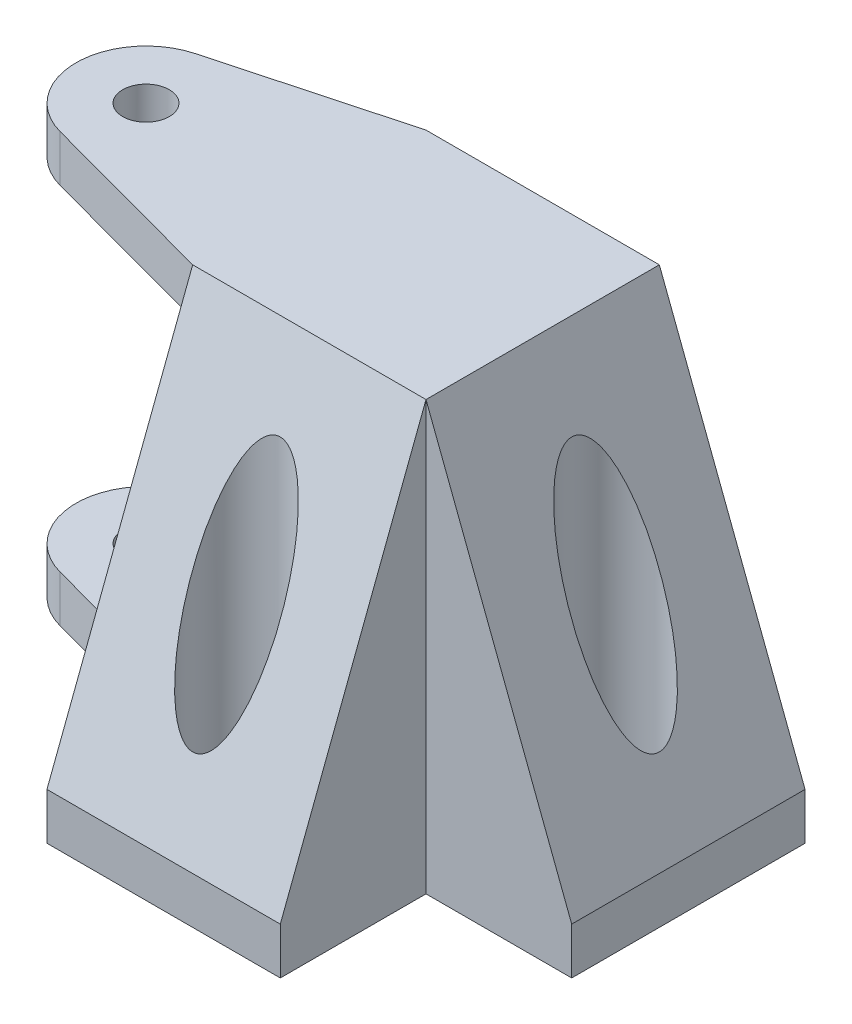
ISO-10303-21;
HEADER;
FILE_DESCRIPTION(('STEP AP214'),'2;1');
FILE_NAME('part.step','',(''),(''),'','','');
FILE_SCHEMA(('AUTOMOTIVE_DESIGN { 1 0 10303 214 1 1 1 1 }'));
ENDSEC;
DATA;
#1=APPLICATION_CONTEXT('core data for automotive mechanical design processes');
#2=APPLICATION_PROTOCOL_DEFINITION('international standard','automotive_design',2000,#1);
#3=PRODUCT_CONTEXT('',#1,'mechanical');
#4=PRODUCT('Part','Part','',(#3));
#5=PRODUCT_RELATED_PRODUCT_CATEGORY('part','',(#4));
#6=PRODUCT_DEFINITION_FORMATION('','',#4);
#7=PRODUCT_DEFINITION_CONTEXT('part definition',#1,'design');
#8=PRODUCT_DEFINITION('design','',#6,#7);
#9=PRODUCT_DEFINITION_SHAPE('','',#8);
#10=(LENGTH_UNIT() NAMED_UNIT(*) SI_UNIT(.MILLI.,.METRE.));
#11=(NAMED_UNIT(*) PLANE_ANGLE_UNIT() SI_UNIT($,.RADIAN.));
#12=(NAMED_UNIT(*) SI_UNIT($,.STERADIAN.) SOLID_ANGLE_UNIT());
#13=UNCERTAINTY_MEASURE_WITH_UNIT(LENGTH_MEASURE(1.E-05),#10,'distance_accuracy_value','');
#14=(GEOMETRIC_REPRESENTATION_CONTEXT(3) GLOBAL_UNCERTAINTY_ASSIGNED_CONTEXT((#13)) GLOBAL_UNIT_ASSIGNED_CONTEXT((#10,
#11,#12)) REPRESENTATION_CONTEXT('',''));
#15=CARTESIAN_POINT('',(0.,0.,0.));
#16=DIRECTION('',(0.,0.,1.));
#17=DIRECTION('',(1.,0.,0.));
#18=AXIS2_PLACEMENT_3D('',#15,#16,#17);
#19=CARTESIAN_POINT('',(-20.,0.,52.4890829694323));
#20=DIRECTION('',(0.,1.,0.));
#21=DIRECTION('',(0.,0.,1.));
#22=AXIS2_PLACEMENT_3D('',#19,#20,#21);
#23=CYLINDRICAL_SURFACE('',#22,4.);
#24=CARTESIAN_POINT('',(-20.,0.,52.4890829694323));
#25=DIRECTION('',(0.,1.,0.));
#26=DIRECTION('',(0.,0.,1.));
#27=AXIS2_PLACEMENT_3D('',#24,#25,#26);
#28=CIRCLE('',#27,4.);
#29=CARTESIAN_POINT('',(-20.,0.,56.4890829694323));
#30=VERTEX_POINT('',#29);
#31=EDGE_CURVE('E323',#30,#30,#28,.T.);
#32=ORIENTED_EDGE('',*,*,#31,.F.);
#33=EDGE_LOOP('',(#32));
#34=FACE_BOUND('',#33,.T.);
#35=CARTESIAN_POINT('',(-20.,5.,52.4890829694323));
#36=DIRECTION('',(0.,1.,0.));
#37=DIRECTION('',(0.,0.,1.));
#38=AXIS2_PLACEMENT_3D('',#35,#36,#37);
#39=CIRCLE('',#38,4.);
#40=CARTESIAN_POINT('',(-20.,5.,56.4890829694323));
#41=VERTEX_POINT('',#40);
#42=EDGE_CURVE('E302',#41,#41,#39,.F.);
#43=ORIENTED_EDGE('',*,*,#42,.F.);
#44=EDGE_LOOP('',(#43));
#45=FACE_BOUND('',#44,.T.);
#46=ADVANCED_FACE('F42',(#34,#45),#23,.F.);
#47=CARTESIAN_POINT('',(12.4890829694323,0.,20.));
#48=DIRECTION('',(0.,1.,0.));
#49=DIRECTION('',(0.,0.,1.));
#50=AXIS2_PLACEMENT_3D('',#47,#48,#49);
#51=CYLINDRICAL_SURFACE('',#50,4.);
#52=CARTESIAN_POINT('',(12.4890829694323,0.,20.));
#53=DIRECTION('',(0.,1.,0.));
#54=DIRECTION('',(0.,0.,1.));
#55=AXIS2_PLACEMENT_3D('',#52,#53,#54);
#56=CIRCLE('',#55,4.);
#57=CARTESIAN_POINT('',(12.4890829694323,0.,24.));
#58=VERTEX_POINT('',#57);
#59=EDGE_CURVE('E297',#58,#58,#56,.T.);
#60=ORIENTED_EDGE('',*,*,#59,.F.);
#61=EDGE_LOOP('',(#60));
#62=FACE_BOUND('',#61,.T.);
#63=CARTESIAN_POINT('',(12.4890829694323,5.,20.));
#64=DIRECTION('',(0.,1.,0.));
#65=DIRECTION('',(0.,0.,1.));
#66=AXIS2_PLACEMENT_3D('',#63,#64,#65);
#67=CIRCLE('',#66,4.);
#68=CARTESIAN_POINT('',(12.4890829694323,5.,24.));
#69=VERTEX_POINT('',#68);
#70=EDGE_CURVE('E298',#69,#69,#67,.F.);
#71=ORIENTED_EDGE('',*,*,#70,.F.);
#72=EDGE_LOOP('',(#71));
#73=FACE_BOUND('',#72,.T.);
#74=ADVANCED_FACE('F358',(#62,#73),#51,.F.);
#75=CARTESIAN_POINT('',(0.,0.,40.));
#76=DIRECTION('',(0.,0.,-1.));
#77=DIRECTION('',(-1.,0.,0.));
#78=AXIS2_PLACEMENT_3D('',#75,#76,#77);
#79=PLANE('',#78);
#80=DIRECTION('',(0.,1.,0.));
#81=VECTOR('',#80,1.);
#82=CARTESIAN_POINT('',(0.,73.3918284369733,40.));
#83=LINE('',#82,#81);
#84=CARTESIAN_POINT('',(0.,0.,40.));
#85=VERTEX_POINT('',#84);
#86=CARTESIAN_POINT('',(0.,73.3918284369733,40.));
#87=VERTEX_POINT('',#86);
#88=EDGE_CURVE('E60',#85,#87,#83,.T.);
#89=ORIENTED_EDGE('',*,*,#88,.F.);
#90=DIRECTION('',(1.,0.,0.));
#91=VECTOR('',#90,1.);
#92=CARTESIAN_POINT('',(0.,0.,40.));
#93=LINE('',#92,#91);
#94=CARTESIAN_POINT('',(24.9781659388646,0.,40.));
#95=VERTEX_POINT('',#94);
#96=EDGE_CURVE('E246',#85,#95,#93,.T.);
#97=ORIENTED_EDGE('',*,*,#96,.T.);
#98=DIRECTION('',(0.,1.,0.));
#99=VECTOR('',#98,1.);
#100=CARTESIAN_POINT('',(24.9781659388646,8.,40.));
#101=LINE('',#100,#99);
#102=CARTESIAN_POINT('',(24.9781659388646,8.,40.));
#103=VERTEX_POINT('',#102);
#104=EDGE_CURVE('E249',#95,#103,#101,.T.);
#105=ORIENTED_EDGE('',*,*,#104,.T.);
#106=DIRECTION('',(-0.35683094198378,0.934168977671046,0.));
#107=VECTOR('',#106,1.);
#108=CARTESIAN_POINT('',(0.,73.3918284369733,40.));
#109=LINE('',#108,#107);
#110=EDGE_CURVE('E253',#103,#87,#109,.T.);
#111=ORIENTED_EDGE('',*,*,#110,.T.);
#112=EDGE_LOOP('',(#89,#97,#105,#111));
#113=FACE_BOUND('',#112,.T.);
#114=ADVANCED_FACE('F364',(#113),#79,.F.);
#115=CARTESIAN_POINT('',(-40.,0.,40.));
#116=DIRECTION('',(0.260963361371524,0.,-0.965348705920133));
#117=DIRECTION('',(-0.965348705920133,0.,-0.260963361371524));
#118=AXIS2_PLACEMENT_3D('',#115,#116,#117);
#119=PLANE('',#118);
#120=DIRECTION('',(-0.965348705920133,0.,-0.260963361371524));
#121=VECTOR('',#120,1.);
#122=CARTESIAN_POINT('',(-40.,65.3918284369732,40.));
#123=LINE('',#122,#121);
#124=CARTESIAN_POINT('',(-40.,65.3918284369732,40.));
#125=VERTEX_POINT('',#124);
#126=CARTESIAN_POINT('',(-71.1315603364583,65.3918284369732,31.5841844710416));
#127=VERTEX_POINT('',#126);
#128=EDGE_CURVE('E210',#125,#127,#123,.T.);
#129=ORIENTED_EDGE('',*,*,#128,.F.);
#130=DIRECTION('',(0.,-1.,0.));
#131=VECTOR('',#130,1.);
#132=CARTESIAN_POINT('',(-40.,0.,40.));
#133=LINE('',#132,#131);
#134=CARTESIAN_POINT('',(-40.,73.3918284369733,40.));
#135=VERTEX_POINT('',#134);
#136=EDGE_CURVE('E259',#135,#125,#133,.T.);
#137=ORIENTED_EDGE('',*,*,#136,.F.);
#138=DIRECTION('',(-0.965348705920133,0.,-0.260963361371524));
#139=VECTOR('',#138,1.);
#140=CARTESIAN_POINT('',(-40.,73.3918284369733,40.));
#141=LINE('',#140,#139);
#142=CARTESIAN_POINT('',(-71.1315603364583,73.3918284369733,31.5841844710416));
#143=VERTEX_POINT('',#142);
#144=EDGE_CURVE('E213',#135,#143,#141,.T.);
#145=ORIENTED_EDGE('',*,*,#144,.T.);
#146=DIRECTION('',(0.,1.,0.));
#147=VECTOR('',#146,1.);
#148=CARTESIAN_POINT('',(-71.1315603364583,0.,31.5841844710416));
#149=LINE('',#148,#147);
#150=EDGE_CURVE('E240',#127,#143,#149,.T.);
#151=ORIENTED_EDGE('',*,*,#150,.F.);
#152=EDGE_LOOP('',(#129,#137,#145,#151));
#153=FACE_BOUND('',#152,.T.);
#154=ADVANCED_FACE('F403',(#153),#119,.F.);
#155=DIRECTION('',(0.965348705920133,0.,0.260963361371524));
#156=VECTOR('',#155,1.);
#157=CARTESIAN_POINT('',(-40.,8.,40.));
#158=LINE('',#157,#156);
#159=CARTESIAN_POINT('',(-71.1315603364583,8.,31.5841844710416));
#160=VERTEX_POINT('',#159);
#161=CARTESIAN_POINT('',(-40.,8.,40.));
#162=VERTEX_POINT('',#161);
#163=EDGE_CURVE('E204',#160,#162,#158,.T.);
#164=ORIENTED_EDGE('',*,*,#163,.F.);
#165=CARTESIAN_POINT('',(-71.1315603364583,0.,31.5841844710416));
#166=VERTEX_POINT('',#165);
#167=EDGE_CURVE('E241',#166,#160,#149,.T.);
#168=ORIENTED_EDGE('',*,*,#167,.F.);
#169=DIRECTION('',(-0.965348705920133,0.,-0.260963361371524));
#170=VECTOR('',#169,1.);
#171=CARTESIAN_POINT('',(-40.,0.,40.));
#172=LINE('',#171,#170);
#173=CARTESIAN_POINT('',(-40.,0.,40.));
#174=VERTEX_POINT('',#173);
#175=EDGE_CURVE('E214',#174,#166,#172,.T.);
#176=ORIENTED_EDGE('',*,*,#175,.F.);
#177=EDGE_CURVE('E258',#162,#174,#133,.T.);
#178=ORIENTED_EDGE('',*,*,#177,.F.);
#179=EDGE_LOOP('',(#164,#168,#176,#178));
#180=FACE_BOUND('',#179,.T.);
#181=ADVANCED_FACE('F401',(#180),#119,.F.);
#182=CARTESIAN_POINT('',(-68.,0.,20.));
#183=DIRECTION('',(0.,1.,0.));
#184=DIRECTION('',(0.,0.,1.));
#185=AXIS2_PLACEMENT_3D('',#182,#183,#184);
#186=CYLINDRICAL_SURFACE('',#185,12.);
#187=DIRECTION('',(0.,1.,0.));
#188=VECTOR('',#187,1.);
#189=CARTESIAN_POINT('',(-71.1315603364583,0.,8.41581552895841));
#190=LINE('',#189,#188);
#191=CARTESIAN_POINT('',(-71.1315603364583,65.3918284369732,8.41581552895842));
#192=VERTEX_POINT('',#191);
#193=CARTESIAN_POINT('',(-71.1315603364583,73.3918284369733,8.41581552895841));
#194=VERTEX_POINT('',#193);
#195=EDGE_CURVE('E225',#192,#194,#190,.T.);
#196=ORIENTED_EDGE('',*,*,#195,.F.);
#197=CARTESIAN_POINT('',(-68.,65.3918284369732,20.));
#198=DIRECTION('',(0.,-1.,0.));
#199=DIRECTION('',(0.,0.,-1.));
#200=AXIS2_PLACEMENT_3D('',#197,#198,#199);
#201=CIRCLE('',#200,12.);
#202=EDGE_CURVE('E207',#127,#192,#201,.T.);
#203=ORIENTED_EDGE('',*,*,#202,.F.);
#204=ORIENTED_EDGE('',*,*,#150,.T.);
#205=CARTESIAN_POINT('',(-68.,73.3918284369733,20.));
#206=DIRECTION('',(0.,-1.,0.));
#207=DIRECTION('',(0.,0.,-1.));
#208=AXIS2_PLACEMENT_3D('',#205,#206,#207);
#209=CIRCLE('',#208,12.);
#210=EDGE_CURVE('E229',#143,#194,#209,.T.);
#211=ORIENTED_EDGE('',*,*,#210,.T.);
#212=EDGE_LOOP('',(#196,#203,#204,#211));
#213=FACE_BOUND('',#212,.T.);
#214=ADVANCED_FACE('F398',(#213),#186,.T.);
#215=CARTESIAN_POINT('',(-68.,8.,20.));
#216=DIRECTION('',(0.,1.,0.));
#217=DIRECTION('',(-1.,0.,0.));
#218=AXIS2_PLACEMENT_3D('',#215,#216,#217);
#219=CIRCLE('',#218,12.);
#220=CARTESIAN_POINT('',(-71.1315603364583,8.,8.41581552895842));
#221=VERTEX_POINT('',#220);
#222=EDGE_CURVE('E201',#221,#160,#219,.T.);
#223=ORIENTED_EDGE('',*,*,#222,.F.);
#224=CARTESIAN_POINT('',(-71.1315603364583,0.,8.41581552895841));
#225=VERTEX_POINT('',#224);
#226=EDGE_CURVE('E236',#225,#221,#190,.T.);
#227=ORIENTED_EDGE('',*,*,#226,.F.);
#228=CARTESIAN_POINT('',(-68.,0.,20.));
#229=DIRECTION('',(0.,-1.,0.));
#230=DIRECTION('',(0.,0.,-1.));
#231=AXIS2_PLACEMENT_3D('',#228,#229,#230);
#232=CIRCLE('',#231,12.);
#233=EDGE_CURVE('E217',#166,#225,#232,.T.);
#234=ORIENTED_EDGE('',*,*,#233,.F.);
#235=ORIENTED_EDGE('',*,*,#167,.T.);
#236=EDGE_LOOP('',(#223,#227,#234,#235));
#237=FACE_BOUND('',#236,.T.);
#238=ADVANCED_FACE('F396',(#237),#186,.T.);
#239=CARTESIAN_POINT('',(-40.,0.,0.));
#240=DIRECTION('',(-0.260963361371524,0.,-0.965348705920133));
#241=DIRECTION('',(-0.965348705920133,0.,0.260963361371524));
#242=AXIS2_PLACEMENT_3D('',#239,#240,#241);
#243=PLANE('',#242);
#244=DIRECTION('',(0.,-1.,0.));
#245=VECTOR('',#244,1.);
#246=CARTESIAN_POINT('',(-40.,0.,0.));
#247=LINE('',#246,#245);
#248=CARTESIAN_POINT('',(-40.,73.3918284369733,0.));
#249=VERTEX_POINT('',#248);
#250=CARTESIAN_POINT('',(-40.,65.3918284369732,0.));
#251=VERTEX_POINT('',#250);
#252=EDGE_CURVE('E273',#249,#251,#247,.T.);
#253=ORIENTED_EDGE('',*,*,#252,.T.);
#254=DIRECTION('',(-0.965348705920133,0.,0.260963361371524));
#255=VECTOR('',#254,1.);
#256=CARTESIAN_POINT('',(-40.,65.3918284369732,0.));
#257=LINE('',#256,#255);
#258=EDGE_CURVE('E11',#251,#192,#257,.T.);
#259=ORIENTED_EDGE('',*,*,#258,.T.);
#260=ORIENTED_EDGE('',*,*,#195,.T.);
#261=DIRECTION('',(-0.965348705920133,0.,0.260963361371524));
#262=VECTOR('',#261,1.);
#263=CARTESIAN_POINT('',(-40.,73.3918284369733,0.));
#264=LINE('',#263,#262);
#265=EDGE_CURVE('E218',#249,#194,#264,.T.);
#266=ORIENTED_EDGE('',*,*,#265,.F.);
#267=EDGE_LOOP('',(#253,#259,#260,#266));
#268=FACE_BOUND('',#267,.T.);
#269=ADVANCED_FACE('F392',(#268),#243,.T.);
#270=ORIENTED_EDGE('',*,*,#226,.T.);
#271=DIRECTION('',(0.965348705920133,0.,-0.260963361371524));
#272=VECTOR('',#271,1.);
#273=CARTESIAN_POINT('',(-40.,8.,0.));
#274=LINE('',#273,#272);
#275=CARTESIAN_POINT('',(-40.,8.,0.));
#276=VERTEX_POINT('',#275);
#277=EDGE_CURVE('E52',#221,#276,#274,.T.);
#278=ORIENTED_EDGE('',*,*,#277,.T.);
#279=CARTESIAN_POINT('',(-40.,0.,0.));
#280=VERTEX_POINT('',#279);
#281=EDGE_CURVE('E272',#276,#280,#247,.T.);
#282=ORIENTED_EDGE('',*,*,#281,.T.);
#283=DIRECTION('',(-0.965348705920133,0.,0.260963361371524));
#284=VECTOR('',#283,1.);
#285=CARTESIAN_POINT('',(-40.,0.,0.));
#286=LINE('',#285,#284);
#287=EDGE_CURVE('E221',#280,#225,#286,.T.);
#288=ORIENTED_EDGE('',*,*,#287,.T.);
#289=EDGE_LOOP('',(#270,#278,#282,#288));
#290=FACE_BOUND('',#289,.T.);
#291=ADVANCED_FACE('F395',(#290),#243,.T.);
#292=CARTESIAN_POINT('',(24.9781659388646,8.,40.));
#293=DIRECTION('',(-1.,0.,0.));
#294=DIRECTION('',(0.,-1.,0.));
#295=AXIS2_PLACEMENT_3D('',#292,#293,#294);
#296=PLANE('',#295);
#297=DIRECTION('',(0.,1.,0.));
#298=VECTOR('',#297,1.);
#299=CARTESIAN_POINT('',(24.9781659388646,8.,0.));
#300=LINE('',#299,#298);
#301=CARTESIAN_POINT('',(24.9781659388646,0.,0.));
#302=VERTEX_POINT('',#301);
#303=CARTESIAN_POINT('',(24.9781659388646,8.,0.));
#304=VERTEX_POINT('',#303);
#305=EDGE_CURVE('E245',#302,#304,#300,.T.);
#306=ORIENTED_EDGE('',*,*,#305,.T.);
#307=DIRECTION('',(0.,0.,-1.));
#308=VECTOR('',#307,1.);
#309=CARTESIAN_POINT('',(24.9781659388646,8.,40.));
#310=LINE('',#309,#308);
#311=EDGE_CURVE('E282',#103,#304,#310,.T.);
#312=ORIENTED_EDGE('',*,*,#311,.F.);
#313=ORIENTED_EDGE('',*,*,#104,.F.);
#314=DIRECTION('',(0.,0.,-1.));
#315=VECTOR('',#314,1.);
#316=CARTESIAN_POINT('',(24.9781659388646,0.,40.));
#317=LINE('',#316,#315);
#318=EDGE_CURVE('E286',#95,#302,#317,.T.);
#319=ORIENTED_EDGE('',*,*,#318,.T.);
#320=EDGE_LOOP('',(#306,#312,#313,#319));
#321=FACE_BOUND('',#320,.T.);
#322=ADVANCED_FACE('F44',(#321),#296,.F.);
#323=CARTESIAN_POINT('',(0.,73.3918284369733,40.));
#324=DIRECTION('',(-0.934168977671047,-0.35683094198378,0.));
#325=DIRECTION('',(0.35683094198378,-0.934168977671047,0.));
#326=AXIS2_PLACEMENT_3D('',#323,#324,#325);
#327=PLANE('',#326);
#328=CARTESIAN_POINT('',(12.4890829694323,40.6959142184866,20.));
#329=DIRECTION('',(-0.934168977671047,-0.35683094198378,0.));
#330=DIRECTION('',(0.35683094198378,-0.934168977671047,0.));
#331=AXIS2_PLACEMENT_3D('',#328,#329,#330);
#332=ELLIPSE('',#331,21.0183566433567,7.5);
#333=CARTESIAN_POINT('',(19.9890829694323,21.0612174806367,20.));
#334=VERTEX_POINT('',#333);
#335=EDGE_CURVE('E46',#334,#334,#332,.F.);
#336=ORIENTED_EDGE('',*,*,#335,.F.);
#337=EDGE_LOOP('',(#336));
#338=FACE_BOUND('',#337,.T.);
#339=DIRECTION('',(-0.35683094198378,0.934168977671046,0.));
#340=VECTOR('',#339,1.);
#341=CARTESIAN_POINT('',(0.,73.3918284369733,0.));
#342=LINE('',#341,#340);
#343=CARTESIAN_POINT('',(0.,73.3918284369733,0.));
#344=VERTEX_POINT('',#343);
#345=EDGE_CURVE('E265',#304,#344,#342,.T.);
#346=ORIENTED_EDGE('',*,*,#345,.T.);
#347=DIRECTION('',(0.,0.,-1.));
#348=VECTOR('',#347,1.);
#349=CARTESIAN_POINT('',(0.,73.3918284369733,40.));
#350=LINE('',#349,#348);
#351=EDGE_CURVE('E262',#87,#344,#350,.T.);
#352=ORIENTED_EDGE('',*,*,#351,.F.);
#353=ORIENTED_EDGE('',*,*,#110,.F.);
#354=ORIENTED_EDGE('',*,*,#311,.T.);
#355=EDGE_LOOP('',(#346,#352,#353,#354));
#356=FACE_BOUND('',#355,.T.);
#357=ADVANCED_FACE('F418',(#338,#356),#327,.F.);
#358=CARTESIAN_POINT('',(-40.,73.3918284369733,40.));
#359=DIRECTION('',(0.,-1.,0.));
#360=DIRECTION('',(0.,0.,-1.));
#361=AXIS2_PLACEMENT_3D('',#358,#359,#360);
#362=PLANE('',#361);
#363=CARTESIAN_POINT('',(-68.,73.3918284369733,20.));
#364=DIRECTION('',(0.,1.,0.));
#365=DIRECTION('',(0.,0.,1.));
#366=AXIS2_PLACEMENT_3D('',#363,#364,#365);
#367=CIRCLE('',#366,4.00000000000001);
#368=CARTESIAN_POINT('',(-68.,73.3918284369733,24.));
#369=VERTEX_POINT('',#368);
#370=EDGE_CURVE('E318',#369,#369,#367,.T.);
#371=ORIENTED_EDGE('',*,*,#370,.F.);
#372=EDGE_LOOP('',(#371));
#373=FACE_BOUND('',#372,.T.);
#374=DIRECTION('',(-1.,0.,0.));
#375=VECTOR('',#374,1.);
#376=CARTESIAN_POINT('',(-40.,73.3918284369733,0.));
#377=LINE('',#376,#375);
#378=EDGE_CURVE('E268',#344,#249,#377,.T.);
#379=ORIENTED_EDGE('',*,*,#378,.T.);
#380=ORIENTED_EDGE('',*,*,#265,.T.);
#381=ORIENTED_EDGE('',*,*,#210,.F.);
#382=ORIENTED_EDGE('',*,*,#144,.F.);
#383=DIRECTION('',(-1.,0.,0.));
#384=VECTOR('',#383,1.);
#385=CARTESIAN_POINT('',(-40.,73.3918284369733,40.));
#386=LINE('',#385,#384);
#387=EDGE_CURVE('E170',#87,#135,#386,.T.);
#388=ORIENTED_EDGE('',*,*,#387,.F.);
#389=ORIENTED_EDGE('',*,*,#351,.T.);
#390=EDGE_LOOP('',(#379,#380,#381,#382,#388,#389));
#391=FACE_BOUND('',#390,.T.);
#392=ADVANCED_FACE('F415',(#373,#391),#362,.F.);
#393=CARTESIAN_POINT('',(0.,0.,40.));
#394=DIRECTION('',(0.,1.,0.));
#395=DIRECTION('',(0.,0.,1.));
#396=AXIS2_PLACEMENT_3D('',#393,#394,#395);
#397=PLANE('',#396);
#398=ORIENTED_EDGE('',*,*,#59,.T.);
#399=EDGE_LOOP('',(#398));
#400=FACE_BOUND('',#399,.T.);
#401=ORIENTED_EDGE('',*,*,#31,.T.);
#402=EDGE_LOOP('',(#401));
#403=FACE_BOUND('',#402,.T.);
#404=CARTESIAN_POINT('',(-68.,0.,20.));
#405=DIRECTION('',(0.,1.,0.));
#406=DIRECTION('',(0.,0.,1.));
#407=AXIS2_PLACEMENT_3D('',#404,#405,#406);
#408=CIRCLE('',#407,4.00000000000001);
#409=CARTESIAN_POINT('',(-68.,0.,24.));
#410=VERTEX_POINT('',#409);
#411=EDGE_CURVE('E313',#410,#410,#408,.T.);
#412=ORIENTED_EDGE('',*,*,#411,.T.);
#413=EDGE_LOOP('',(#412));
#414=FACE_BOUND('',#413,.T.);
#415=DIRECTION('',(1.,0.,0.));
#416=VECTOR('',#415,1.);
#417=CARTESIAN_POINT('',(0.,0.,0.));
#418=LINE('',#417,#416);
#419=EDGE_CURVE('E250',#280,#302,#418,.T.);
#420=ORIENTED_EDGE('',*,*,#419,.T.);
#421=ORIENTED_EDGE('',*,*,#318,.F.);
#422=ORIENTED_EDGE('',*,*,#96,.F.);
#423=DIRECTION('',(0.,0.,-1.));
#424=VECTOR('',#423,1.);
#425=CARTESIAN_POINT('',(0.,0.,64.9781659388646));
#426=LINE('',#425,#424);
#427=CARTESIAN_POINT('',(0.,0.,64.9781659388646));
#428=VERTEX_POINT('',#427);
#429=EDGE_CURVE('E172',#428,#85,#426,.T.);
#430=ORIENTED_EDGE('',*,*,#429,.F.);
#431=DIRECTION('',(1.,0.,0.));
#432=VECTOR('',#431,1.);
#433=CARTESIAN_POINT('',(-40.,0.,64.9781659388646));
#434=LINE('',#433,#432);
#435=CARTESIAN_POINT('',(-40.,0.,64.9781659388646));
#436=VERTEX_POINT('',#435);
#437=EDGE_CURVE('E157',#436,#428,#434,.T.);
#438=ORIENTED_EDGE('',*,*,#437,.F.);
#439=DIRECTION('',(0.,0.,-1.));
#440=VECTOR('',#439,1.);
#441=CARTESIAN_POINT('',(-40.,0.,64.9781659388646));
#442=LINE('',#441,#440);
#443=EDGE_CURVE('E158',#436,#174,#442,.T.);
#444=ORIENTED_EDGE('',*,*,#443,.T.);
#445=ORIENTED_EDGE('',*,*,#175,.T.);
#446=ORIENTED_EDGE('',*,*,#233,.T.);
#447=ORIENTED_EDGE('',*,*,#287,.F.);
#448=EDGE_LOOP('',(#420,#421,#422,#430,#438,#444,#445,#446,#447));
#449=FACE_BOUND('',#448,.T.);
#450=ADVANCED_FACE('F411',(#400,#403,#414,#449),#397,.F.);
#451=CARTESIAN_POINT('',(0.,0.,0.));
#452=DIRECTION('',(0.,0.,-1.));
#453=DIRECTION('',(-1.,0.,0.));
#454=AXIS2_PLACEMENT_3D('',#451,#452,#453);
#455=PLANE('',#454);
#456=ORIENTED_EDGE('',*,*,#305,.F.);
#457=ORIENTED_EDGE('',*,*,#419,.F.);
#458=ORIENTED_EDGE('',*,*,#281,.F.);
#459=DIRECTION('',(0.,1.,0.));
#460=VECTOR('',#459,1.);
#461=CARTESIAN_POINT('',(-40.,8.,0.));
#462=LINE('',#461,#460);
#463=EDGE_CURVE('E191',#276,#251,#462,.T.);
#464=ORIENTED_EDGE('',*,*,#463,.T.);
#465=ORIENTED_EDGE('',*,*,#252,.F.);
#466=ORIENTED_EDGE('',*,*,#378,.F.);
#467=ORIENTED_EDGE('',*,*,#345,.F.);
#468=EDGE_LOOP('',(#456,#457,#458,#464,#465,#466,#467));
#469=FACE_BOUND('',#468,.T.);
#470=ADVANCED_FACE('F390',(#469),#455,.T.);
#471=CARTESIAN_POINT('',(-40.,65.3918284369732,73.));
#472=DIRECTION('',(0.,-1.,0.));
#473=DIRECTION('',(0.,0.,-1.));
#474=AXIS2_PLACEMENT_3D('',#471,#472,#473);
#475=PLANE('',#474);
#476=CARTESIAN_POINT('',(-68.,65.3918284369732,20.));
#477=DIRECTION('',(0.,-1.,0.));
#478=DIRECTION('',(0.,0.,-1.));
#479=AXIS2_PLACEMENT_3D('',#476,#477,#478);
#480=CIRCLE('',#479,4.00000000000001);
#481=CARTESIAN_POINT('',(-68.,65.3918284369732,16.));
#482=VERTEX_POINT('',#481);
#483=EDGE_CURVE('E178',#482,#482,#480,.T.);
#484=ORIENTED_EDGE('',*,*,#483,.F.);
#485=EDGE_LOOP('',(#484));
#486=FACE_BOUND('',#485,.T.);
#487=ORIENTED_EDGE('',*,*,#128,.T.);
#488=ORIENTED_EDGE('',*,*,#202,.T.);
#489=ORIENTED_EDGE('',*,*,#258,.F.);
#490=DIRECTION('',(0.,0.,-1.));
#491=VECTOR('',#490,1.);
#492=CARTESIAN_POINT('',(-40.,65.3918284369732,73.));
#493=LINE('',#492,#491);
#494=EDGE_CURVE('E68',#125,#251,#493,.T.);
#495=ORIENTED_EDGE('',*,*,#494,.F.);
#496=EDGE_LOOP('',(#487,#488,#489,#495));
#497=FACE_BOUND('',#496,.T.);
#498=ADVANCED_FACE('F386',(#486,#497),#475,.T.);
#499=CARTESIAN_POINT('',(-80.,8.,73.));
#500=DIRECTION('',(0.,1.,0.));
#501=DIRECTION('',(-1.,0.,0.));
#502=AXIS2_PLACEMENT_3D('',#499,#500,#501);
#503=PLANE('',#502);
#504=CARTESIAN_POINT('',(-68.,8.,20.));
#505=DIRECTION('',(0.,1.,0.));
#506=DIRECTION('',(-1.,0.,0.));
#507=AXIS2_PLACEMENT_3D('',#504,#505,#506);
#508=CIRCLE('',#507,4.00000000000001);
#509=CARTESIAN_POINT('',(-72.,8.,20.));
#510=VERTEX_POINT('',#509);
#511=EDGE_CURVE('E293',#510,#510,#508,.T.);
#512=ORIENTED_EDGE('',*,*,#511,.F.);
#513=EDGE_LOOP('',(#512));
#514=FACE_BOUND('',#513,.T.);
#515=ORIENTED_EDGE('',*,*,#163,.T.);
#516=DIRECTION('',(0.,0.,-1.));
#517=VECTOR('',#516,1.);
#518=CARTESIAN_POINT('',(-40.,8.,73.));
#519=LINE('',#518,#517);
#520=EDGE_CURVE('E198',#162,#276,#519,.T.);
#521=ORIENTED_EDGE('',*,*,#520,.T.);
#522=ORIENTED_EDGE('',*,*,#277,.F.);
#523=ORIENTED_EDGE('',*,*,#222,.T.);
#524=EDGE_LOOP('',(#515,#521,#522,#523));
#525=FACE_BOUND('',#524,.T.);
#526=ADVANCED_FACE('F383',(#514,#525),#503,.T.);
#527=CARTESIAN_POINT('',(-40.,8.,73.));
#528=DIRECTION('',(-1.,0.,0.));
#529=DIRECTION('',(0.,0.,1.));
#530=AXIS2_PLACEMENT_3D('',#527,#528,#529);
#531=PLANE('',#530);
#532=ORIENTED_EDGE('',*,*,#520,.F.);
#533=ORIENTED_EDGE('',*,*,#177,.T.);
#534=ORIENTED_EDGE('',*,*,#443,.F.);
#535=DIRECTION('',(0.,-1.,0.));
#536=VECTOR('',#535,1.);
#537=CARTESIAN_POINT('',(-40.,8.,64.9781659388646));
#538=LINE('',#537,#536);
#539=CARTESIAN_POINT('',(-40.,8.,64.9781659388646));
#540=VERTEX_POINT('',#539);
#541=EDGE_CURVE('E148',#540,#436,#538,.T.);
#542=ORIENTED_EDGE('',*,*,#541,.F.);
#543=DIRECTION('',(0.,-0.934168977671046,0.356830941983781));
#544=VECTOR('',#543,1.);
#545=CARTESIAN_POINT('',(-40.,73.3918284369733,40.));
#546=LINE('',#545,#544);
#547=EDGE_CURVE('E163',#135,#540,#546,.T.);
#548=ORIENTED_EDGE('',*,*,#547,.F.);
#549=ORIENTED_EDGE('',*,*,#136,.T.);
#550=ORIENTED_EDGE('',*,*,#494,.T.);
#551=ORIENTED_EDGE('',*,*,#463,.F.);
#552=EDGE_LOOP('',(#532,#533,#534,#542,#548,#549,#550,#551));
#553=FACE_BOUND('',#552,.T.);
#554=ADVANCED_FACE('F162',(#553),#531,.T.);
#555=CARTESIAN_POINT('',(-40.,8.,64.9781659388646));
#556=DIRECTION('',(0.,0.,1.));
#557=DIRECTION('',(1.,0.,0.));
#558=AXIS2_PLACEMENT_3D('',#555,#556,#557);
#559=PLANE('',#558);
#560=DIRECTION('',(0.,-1.,0.));
#561=VECTOR('',#560,1.);
#562=CARTESIAN_POINT('',(0.,8.,64.9781659388646));
#563=LINE('',#562,#561);
#564=CARTESIAN_POINT('',(0.,8.,64.9781659388646));
#565=VERTEX_POINT('',#564);
#566=EDGE_CURVE('E151',#565,#428,#563,.T.);
#567=ORIENTED_EDGE('',*,*,#566,.F.);
#568=DIRECTION('',(1.,0.,0.));
#569=VECTOR('',#568,1.);
#570=CARTESIAN_POINT('',(-40.,8.,64.9781659388646));
#571=LINE('',#570,#569);
#572=EDGE_CURVE('E145',#540,#565,#571,.T.);
#573=ORIENTED_EDGE('',*,*,#572,.F.);
#574=ORIENTED_EDGE('',*,*,#541,.T.);
#575=ORIENTED_EDGE('',*,*,#437,.T.);
#576=EDGE_LOOP('',(#567,#573,#574,#575));
#577=FACE_BOUND('',#576,.T.);
#578=ADVANCED_FACE('F147',(#577),#559,.T.);
#579=CARTESIAN_POINT('',(-40.,73.3918284369733,40.));
#580=DIRECTION('',(0.,0.356830941983781,0.934168977671046));
#581=DIRECTION('',(0.,-0.934168977671046,0.356830941983781));
#582=AXIS2_PLACEMENT_3D('',#579,#580,#581);
#583=PLANE('',#582);
#584=CARTESIAN_POINT('',(-20.,40.6959142184866,52.4890829694323));
#585=DIRECTION('',(0.,0.356830941983781,0.934168977671046));
#586=DIRECTION('',(0.,-0.934168977671046,0.356830941983781));
#587=AXIS2_PLACEMENT_3D('',#584,#585,#586);
#588=ELLIPSE('',#587,21.0183566433566,7.5);
#589=CARTESIAN_POINT('',(-20.,21.0612174806367,59.9890829694323));
#590=VERTEX_POINT('',#589);
#591=EDGE_CURVE('E306',#590,#590,#588,.F.);
#592=ORIENTED_EDGE('',*,*,#591,.T.);
#593=EDGE_LOOP('',(#592));
#594=FACE_BOUND('',#593,.T.);
#595=DIRECTION('',(0.,-0.934168977671046,0.356830941983781));
#596=VECTOR('',#595,1.);
#597=CARTESIAN_POINT('',(0.,73.3918284369733,40.));
#598=LINE('',#597,#596);
#599=EDGE_CURVE('E185',#87,#565,#598,.T.);
#600=ORIENTED_EDGE('',*,*,#599,.F.);
#601=ORIENTED_EDGE('',*,*,#387,.T.);
#602=ORIENTED_EDGE('',*,*,#547,.T.);
#603=ORIENTED_EDGE('',*,*,#572,.T.);
#604=EDGE_LOOP('',(#600,#601,#602,#603));
#605=FACE_BOUND('',#604,.T.);
#606=ADVANCED_FACE('F169',(#594,#605),#583,.T.);
#607=CARTESIAN_POINT('',(0.,0.,0.));
#608=DIRECTION('',(1.,0.,0.));
#609=DIRECTION('',(0.,0.,-1.));
#610=AXIS2_PLACEMENT_3D('',#607,#608,#609);
#611=PLANE('',#610);
#612=ORIENTED_EDGE('',*,*,#88,.T.);
#613=ORIENTED_EDGE('',*,*,#599,.T.);
#614=ORIENTED_EDGE('',*,*,#566,.T.);
#615=ORIENTED_EDGE('',*,*,#429,.T.);
#616=EDGE_LOOP('',(#612,#613,#614,#615));
#617=FACE_BOUND('',#616,.T.);
#618=ADVANCED_FACE('F372',(#617),#611,.T.);
#619=CARTESIAN_POINT('',(-68.,0.,20.));
#620=DIRECTION('',(0.,1.,0.));
#621=DIRECTION('',(0.,0.,1.));
#622=AXIS2_PLACEMENT_3D('',#619,#620,#621);
#623=CYLINDRICAL_SURFACE('',#622,4.00000000000001);
#624=ORIENTED_EDGE('',*,*,#511,.T.);
#625=EDGE_LOOP('',(#624));
#626=FACE_BOUND('',#625,.T.);
#627=ORIENTED_EDGE('',*,*,#411,.F.);
#628=EDGE_LOOP('',(#627));
#629=FACE_BOUND('',#628,.T.);
#630=ADVANCED_FACE('F353',(#626,#629),#623,.F.);
#631=ORIENTED_EDGE('',*,*,#483,.T.);
#632=EDGE_LOOP('',(#631));
#633=FACE_BOUND('',#632,.T.);
#634=ORIENTED_EDGE('',*,*,#370,.T.);
#635=EDGE_LOOP('',(#634));
#636=FACE_BOUND('',#635,.T.);
#637=ADVANCED_FACE('F345',(#633,#636),#623,.F.);
#638=CARTESIAN_POINT('',(12.4890829694323,73.3918284369733,20.));
#639=DIRECTION('',(0.,-1.,0.));
#640=DIRECTION('',(0.,0.,-1.));
#641=AXIS2_PLACEMENT_3D('',#638,#639,#640);
#642=CYLINDRICAL_SURFACE('',#641,7.5);
#643=CARTESIAN_POINT('',(12.4890829694323,5.,20.));
#644=DIRECTION('',(0.,1.,0.));
#645=DIRECTION('',(0.,0.,1.));
#646=AXIS2_PLACEMENT_3D('',#643,#644,#645);
#647=CIRCLE('',#646,7.5);
#648=CARTESIAN_POINT('',(12.4890829694323,5.,27.5));
#649=VERTEX_POINT('',#648);
#650=EDGE_CURVE('E303',#649,#649,#647,.T.);
#651=ORIENTED_EDGE('',*,*,#650,.F.);
#652=EDGE_LOOP('',(#651));
#653=FACE_BOUND('',#652,.T.);
#654=ORIENTED_EDGE('',*,*,#335,.T.);
#655=EDGE_LOOP('',(#654));
#656=FACE_BOUND('',#655,.T.);
#657=ADVANCED_FACE('F343',(#653,#656),#642,.F.);
#658=CARTESIAN_POINT('',(12.4890829694323,5.,20.));
#659=DIRECTION('',(0.,1.,0.));
#660=DIRECTION('',(0.,0.,1.));
#661=AXIS2_PLACEMENT_3D('',#658,#659,#660);
#662=PLANE('',#661);
#663=ORIENTED_EDGE('',*,*,#650,.T.);
#664=EDGE_LOOP('',(#663));
#665=FACE_BOUND('',#664,.T.);
#666=ORIENTED_EDGE('',*,*,#70,.T.);
#667=EDGE_LOOP('',(#666));
#668=FACE_BOUND('',#667,.T.);
#669=ADVANCED_FACE('F340',(#665,#668),#662,.T.);
#670=CARTESIAN_POINT('',(-20.,5.,52.4890829694323));
#671=DIRECTION('',(0.,1.,0.));
#672=DIRECTION('',(0.,0.,1.));
#673=AXIS2_PLACEMENT_3D('',#670,#671,#672);
#674=PLANE('',#673);
#675=CARTESIAN_POINT('',(-20.,5.,52.4890829694323));
#676=DIRECTION('',(0.,1.,0.));
#677=DIRECTION('',(0.,0.,1.));
#678=AXIS2_PLACEMENT_3D('',#675,#676,#677);
#679=CIRCLE('',#678,7.5);
#680=CARTESIAN_POINT('',(-20.,5.,59.9890829694323));
#681=VERTEX_POINT('',#680);
#682=EDGE_CURVE('E332',#681,#681,#679,.T.);
#683=ORIENTED_EDGE('',*,*,#682,.T.);
#684=EDGE_LOOP('',(#683));
#685=FACE_BOUND('',#684,.T.);
#686=ORIENTED_EDGE('',*,*,#42,.T.);
#687=EDGE_LOOP('',(#686));
#688=FACE_BOUND('',#687,.T.);
#689=ADVANCED_FACE('F351',(#685,#688),#674,.T.);
#690=CARTESIAN_POINT('',(-20.,73.3918284369733,52.4890829694323));
#691=DIRECTION('',(0.,-1.,0.));
#692=DIRECTION('',(0.,0.,-1.));
#693=AXIS2_PLACEMENT_3D('',#690,#691,#692);
#694=CYLINDRICAL_SURFACE('',#693,7.5);
#695=ORIENTED_EDGE('',*,*,#591,.F.);
#696=EDGE_LOOP('',(#695));
#697=FACE_BOUND('',#696,.T.);
#698=ORIENTED_EDGE('',*,*,#682,.F.);
#699=EDGE_LOOP('',(#698));
#700=FACE_BOUND('',#699,.T.);
#701=ADVANCED_FACE('F635',(#697,#700),#694,.F.);
#702=CLOSED_SHELL('',(#46,#74,#114,#154,#181,#214,#238,#269,#291,#322,#357,#392,#450,#470,#498,
#526,#554,#578,#606,#618,#630,#637,#657,#669,#689,#701));
#703=MANIFOLD_SOLID_BREP('B2',#702);
#704=ADVANCED_BREP_SHAPE_REPRESENTATION('',(#18,#703),#14);
#705=SHAPE_DEFINITION_REPRESENTATION(#9,#704);
ENDSEC;
END-ISO-10303-21;
